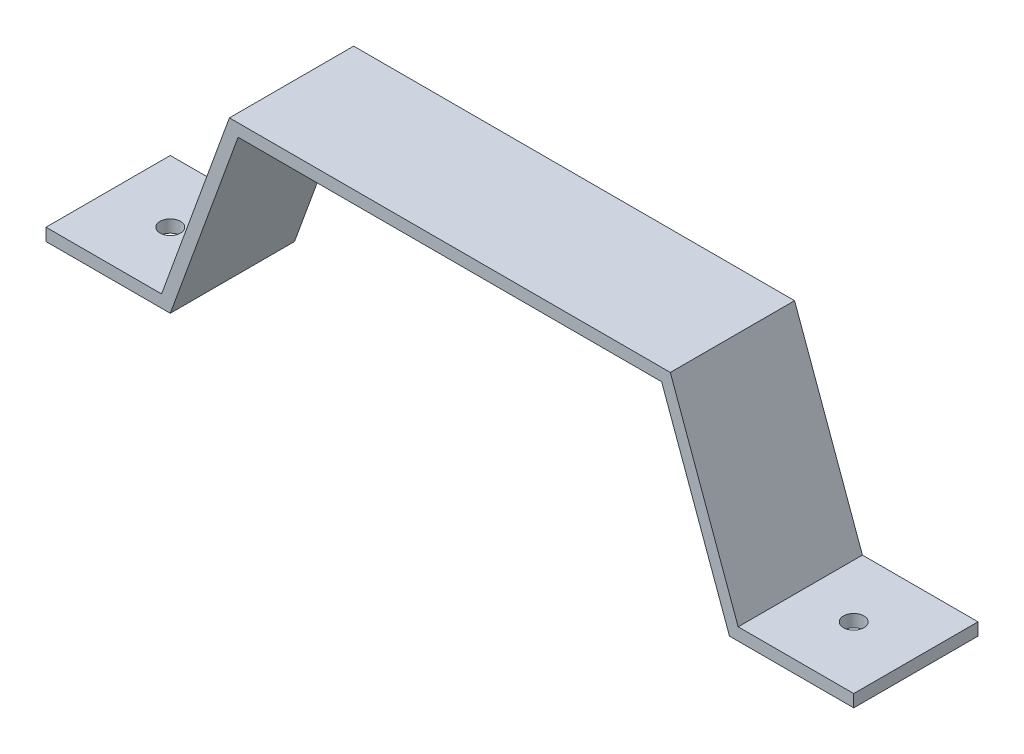
ISO-10303-21;
HEADER;
FILE_DESCRIPTION(('STEP AP214'),'2;1');
FILE_NAME('part.step','',(''),(''),'','','');
FILE_SCHEMA(('AUTOMOTIVE_DESIGN { 1 0 10303 214 1 1 1 1 }'));
ENDSEC;
DATA;
#1=APPLICATION_CONTEXT('core data for automotive mechanical design processes');
#2=APPLICATION_PROTOCOL_DEFINITION('international standard','automotive_design',2000,#1);
#3=PRODUCT_CONTEXT('',#1,'mechanical');
#4=PRODUCT('Part','Part','',(#3));
#5=PRODUCT_RELATED_PRODUCT_CATEGORY('part','',(#4));
#6=PRODUCT_DEFINITION_FORMATION('','',#4);
#7=PRODUCT_DEFINITION_CONTEXT('part definition',#1,'design');
#8=PRODUCT_DEFINITION('design','',#6,#7);
#9=PRODUCT_DEFINITION_SHAPE('','',#8);
#10=(LENGTH_UNIT() NAMED_UNIT(*) SI_UNIT(.MILLI.,.METRE.));
#11=(NAMED_UNIT(*) PLANE_ANGLE_UNIT() SI_UNIT($,.RADIAN.));
#12=(NAMED_UNIT(*) SI_UNIT($,.STERADIAN.) SOLID_ANGLE_UNIT());
#13=UNCERTAINTY_MEASURE_WITH_UNIT(LENGTH_MEASURE(1.E-05),#10,'distance_accuracy_value','');
#14=(GEOMETRIC_REPRESENTATION_CONTEXT(3) GLOBAL_UNCERTAINTY_ASSIGNED_CONTEXT((#13)) GLOBAL_UNIT_ASSIGNED_CONTEXT((#10,
#11,#12)) REPRESENTATION_CONTEXT('',''));
#15=CARTESIAN_POINT('',(0.,0.,0.));
#16=DIRECTION('',(0.,0.,1.));
#17=DIRECTION('',(1.,0.,0.));
#18=AXIS2_PLACEMENT_3D('',#15,#16,#17);
#19=CARTESIAN_POINT('',(-71.3521011514465,2.,20.));
#20=DIRECTION('',(1.,0.,0.));
#21=DIRECTION('',(0.,0.,-1.));
#22=AXIS2_PLACEMENT_3D('',#19,#20,#21);
#23=PLANE('',#22);
#24=DIRECTION('',(0.,-1.,0.));
#25=VECTOR('',#24,1.);
#26=CARTESIAN_POINT('',(-71.3521011514465,2.,0.));
#27=LINE('',#26,#25);
#28=CARTESIAN_POINT('',(-71.3521011514465,2.,0.));
#29=VERTEX_POINT('',#28);
#30=CARTESIAN_POINT('',(-71.3521011514465,0.,0.));
#31=VERTEX_POINT('',#30);
#32=EDGE_CURVE('E163',#29,#31,#27,.T.);
#33=ORIENTED_EDGE('',*,*,#32,.T.);
#34=DIRECTION('',(0.,0.,-1.));
#35=VECTOR('',#34,1.);
#36=CARTESIAN_POINT('',(-71.3521011514465,0.,20.));
#37=LINE('',#36,#35);
#38=CARTESIAN_POINT('',(-71.3521011514465,0.,20.));
#39=VERTEX_POINT('',#38);
#40=EDGE_CURVE('E11',#39,#31,#37,.T.);
#41=ORIENTED_EDGE('',*,*,#40,.F.);
#42=DIRECTION('',(0.,-1.,0.));
#43=VECTOR('',#42,1.);
#44=CARTESIAN_POINT('',(-71.3521011514465,2.,20.));
#45=LINE('',#44,#43);
#46=CARTESIAN_POINT('',(-71.3521011514465,2.,20.));
#47=VERTEX_POINT('',#46);
#48=EDGE_CURVE('E185',#47,#39,#45,.T.);
#49=ORIENTED_EDGE('',*,*,#48,.F.);
#50=DIRECTION('',(0.,0.,-1.));
#51=VECTOR('',#50,1.);
#52=CARTESIAN_POINT('',(-71.3521011514465,2.,20.));
#53=LINE('',#52,#51);
#54=EDGE_CURVE('E159',#47,#29,#53,.T.);
#55=ORIENTED_EDGE('',*,*,#54,.T.);
#56=EDGE_LOOP('',(#33,#41,#49,#55));
#57=FACE_BOUND('',#56,.T.);
#58=ADVANCED_FACE('F41',(#57),#23,.F.);
#59=CARTESIAN_POINT('',(-71.3521011514465,0.,20.));
#60=DIRECTION('',(0.,1.,0.));
#61=DIRECTION('',(-1.,0.,0.));
#62=AXIS2_PLACEMENT_3D('',#59,#60,#61);
#63=PLANE('',#62);
#64=CARTESIAN_POINT('',(-61.3521011514465,0.,10.));
#65=DIRECTION('',(0.,1.,0.));
#66=DIRECTION('',(0.,0.,1.));
#67=AXIS2_PLACEMENT_3D('',#64,#65,#66);
#68=CIRCLE('',#67,1.6450916652132);
#69=CARTESIAN_POINT('',(-61.3521011514465,0.,11.6450916652132));
#70=VERTEX_POINT('',#69);
#71=EDGE_CURVE('E215',#70,#70,#68,.T.);
#72=ORIENTED_EDGE('',*,*,#71,.T.);
#73=EDGE_LOOP('',(#72));
#74=FACE_BOUND('',#73,.T.);
#75=DIRECTION('',(1.,0.,0.));
#76=VECTOR('',#75,1.);
#77=CARTESIAN_POINT('',(-71.3521011514465,0.,0.));
#78=LINE('',#77,#76);
#79=CARTESIAN_POINT('',(-51.3521011514465,0.,0.));
#80=VERTEX_POINT('',#79);
#81=EDGE_CURVE('E166',#31,#80,#78,.T.);
#82=ORIENTED_EDGE('',*,*,#81,.T.);
#83=DIRECTION('',(0.,0.,-1.));
#84=VECTOR('',#83,1.);
#85=CARTESIAN_POINT('',(-51.3521011514465,0.,20.));
#86=LINE('',#85,#84);
#87=CARTESIAN_POINT('',(-51.3521011514465,0.,20.));
#88=VERTEX_POINT('',#87);
#89=EDGE_CURVE('E50',#88,#80,#86,.T.);
#90=ORIENTED_EDGE('',*,*,#89,.F.);
#91=DIRECTION('',(1.,0.,0.));
#92=VECTOR('',#91,1.);
#93=CARTESIAN_POINT('',(-71.3521011514465,0.,20.));
#94=LINE('',#93,#92);
#95=EDGE_CURVE('E114',#39,#88,#94,.T.);
#96=ORIENTED_EDGE('',*,*,#95,.F.);
#97=ORIENTED_EDGE('',*,*,#40,.T.);
#98=EDGE_LOOP('',(#82,#90,#96,#97));
#99=FACE_BOUND('',#98,.T.);
#100=ADVANCED_FACE('F266',(#74,#99),#63,.F.);
#101=CARTESIAN_POINT('',(-51.3521011514465,0.,20.));
#102=DIRECTION('',(-0.93969262078591,0.342020143325666,0.));
#103=DIRECTION('',(-0.342020143325666,-0.93969262078591,0.));
#104=AXIS2_PLACEMENT_3D('',#101,#102,#103);
#105=PLANE('',#104);
#106=DIRECTION('',(0.342020143325666,0.93969262078591,0.));
#107=VECTOR('',#106,1.);
#108=CARTESIAN_POINT('',(-51.3521011514465,0.,0.));
#109=LINE('',#108,#107);
#110=CARTESIAN_POINT('',(-40.4329941234606,30.,0.));
#111=VERTEX_POINT('',#110);
#112=EDGE_CURVE('E168',#80,#111,#109,.T.);
#113=ORIENTED_EDGE('',*,*,#112,.T.);
#114=DIRECTION('',(0.,0.,-1.));
#115=VECTOR('',#114,1.);
#116=CARTESIAN_POINT('',(-40.4329941234606,30.,20.));
#117=LINE('',#116,#115);
#118=CARTESIAN_POINT('',(-40.4329941234606,30.,20.));
#119=VERTEX_POINT('',#118);
#120=EDGE_CURVE('E204',#119,#111,#117,.T.);
#121=ORIENTED_EDGE('',*,*,#120,.F.);
#122=DIRECTION('',(0.342020143325666,0.93969262078591,0.));
#123=VECTOR('',#122,1.);
#124=CARTESIAN_POINT('',(-51.3521011514465,0.,20.));
#125=LINE('',#124,#123);
#126=EDGE_CURVE('E224',#88,#119,#125,.T.);
#127=ORIENTED_EDGE('',*,*,#126,.F.);
#128=ORIENTED_EDGE('',*,*,#89,.T.);
#129=EDGE_LOOP('',(#113,#121,#127,#128));
#130=FACE_BOUND('',#129,.T.);
#131=ADVANCED_FACE('F271',(#130),#105,.F.);
#132=CARTESIAN_POINT('',(-40.4329941234606,30.,20.));
#133=DIRECTION('',(0.,1.,0.));
#134=DIRECTION('',(-1.,0.,0.));
#135=AXIS2_PLACEMENT_3D('',#132,#133,#134);
#136=PLANE('',#135);
#137=DIRECTION('',(1.,0.,0.));
#138=VECTOR('',#137,1.);
#139=CARTESIAN_POINT('',(-40.4329941234606,30.,0.));
#140=LINE('',#139,#138);
#141=CARTESIAN_POINT('',(27.7287918205675,30.,0.));
#142=VERTEX_POINT('',#141);
#143=EDGE_CURVE('E170',#111,#142,#140,.T.);
#144=ORIENTED_EDGE('',*,*,#143,.T.);
#145=DIRECTION('',(0.,0.,-1.));
#146=VECTOR('',#145,1.);
#147=CARTESIAN_POINT('',(27.7287918205675,30.,20.));
#148=LINE('',#147,#146);
#149=CARTESIAN_POINT('',(27.7287918205675,30.,20.));
#150=VERTEX_POINT('',#149);
#151=EDGE_CURVE('E201',#150,#142,#148,.T.);
#152=ORIENTED_EDGE('',*,*,#151,.F.);
#153=DIRECTION('',(1.,0.,0.));
#154=VECTOR('',#153,1.);
#155=CARTESIAN_POINT('',(-40.4329941234606,30.,20.));
#156=LINE('',#155,#154);
#157=EDGE_CURVE('E226',#119,#150,#156,.T.);
#158=ORIENTED_EDGE('',*,*,#157,.F.);
#159=ORIENTED_EDGE('',*,*,#120,.T.);
#160=EDGE_LOOP('',(#144,#152,#158,#159));
#161=FACE_BOUND('',#160,.T.);
#162=ADVANCED_FACE('F277',(#161),#136,.F.);
#163=CARTESIAN_POINT('',(38.6478988485535,0.,20.));
#164=DIRECTION('',(0.939692620785909,0.342020143325666,0.));
#165=DIRECTION('',(-0.342020143325666,0.939692620785909,0.));
#166=AXIS2_PLACEMENT_3D('',#163,#164,#165);
#167=PLANE('',#166);
#168=DIRECTION('',(0.342020143325666,-0.939692620785909,0.));
#169=VECTOR('',#168,1.);
#170=CARTESIAN_POINT('',(38.6478988485535,0.,0.));
#171=LINE('',#170,#169);
#172=CARTESIAN_POINT('',(38.6478988485535,0.,0.));
#173=VERTEX_POINT('',#172);
#174=EDGE_CURVE('E172',#142,#173,#171,.T.);
#175=ORIENTED_EDGE('',*,*,#174,.T.);
#176=DIRECTION('',(0.,0.,-1.));
#177=VECTOR('',#176,1.);
#178=CARTESIAN_POINT('',(38.6478988485535,0.,20.));
#179=LINE('',#178,#177);
#180=CARTESIAN_POINT('',(38.6478988485535,0.,20.));
#181=VERTEX_POINT('',#180);
#182=EDGE_CURVE('E198',#181,#173,#179,.T.);
#183=ORIENTED_EDGE('',*,*,#182,.F.);
#184=DIRECTION('',(0.342020143325666,-0.939692620785909,0.));
#185=VECTOR('',#184,1.);
#186=CARTESIAN_POINT('',(38.6478988485535,0.,20.));
#187=LINE('',#186,#185);
#188=EDGE_CURVE('E228',#150,#181,#187,.T.);
#189=ORIENTED_EDGE('',*,*,#188,.F.);
#190=ORIENTED_EDGE('',*,*,#151,.T.);
#191=EDGE_LOOP('',(#175,#183,#189,#190));
#192=FACE_BOUND('',#191,.T.);
#193=ADVANCED_FACE('F283',(#192),#167,.F.);
#194=CARTESIAN_POINT('',(58.6478988485535,0.,20.));
#195=DIRECTION('',(0.,1.,0.));
#196=DIRECTION('',(-1.,0.,0.));
#197=AXIS2_PLACEMENT_3D('',#194,#195,#196);
#198=PLANE('',#197);
#199=CARTESIAN_POINT('',(48.6478988485535,0.,9.99999999999999));
#200=DIRECTION('',(0.,1.,0.));
#201=DIRECTION('',(0.,0.,-1.));
#202=AXIS2_PLACEMENT_3D('',#199,#200,#201);
#203=CIRCLE('',#202,1.6450916652132);
#204=CARTESIAN_POINT('',(48.6478988485535,0.,8.35490833478679));
#205=VERTEX_POINT('',#204);
#206=EDGE_CURVE('E210',#205,#205,#203,.T.);
#207=ORIENTED_EDGE('',*,*,#206,.T.);
#208=EDGE_LOOP('',(#207));
#209=FACE_BOUND('',#208,.T.);
#210=DIRECTION('',(1.,0.,0.));
#211=VECTOR('',#210,1.);
#212=CARTESIAN_POINT('',(58.6478988485535,0.,0.));
#213=LINE('',#212,#211);
#214=CARTESIAN_POINT('',(58.6478988485535,0.,0.));
#215=VERTEX_POINT('',#214);
#216=EDGE_CURVE('E174',#173,#215,#213,.T.);
#217=ORIENTED_EDGE('',*,*,#216,.T.);
#218=DIRECTION('',(0.,0.,-1.));
#219=VECTOR('',#218,1.);
#220=CARTESIAN_POINT('',(58.6478988485535,0.,20.));
#221=LINE('',#220,#219);
#222=CARTESIAN_POINT('',(58.6478988485535,0.,20.));
#223=VERTEX_POINT('',#222);
#224=EDGE_CURVE('E195',#223,#215,#221,.T.);
#225=ORIENTED_EDGE('',*,*,#224,.F.);
#226=DIRECTION('',(1.,0.,0.));
#227=VECTOR('',#226,1.);
#228=CARTESIAN_POINT('',(58.6478988485535,0.,20.));
#229=LINE('',#228,#227);
#230=EDGE_CURVE('E230',#181,#223,#229,.T.);
#231=ORIENTED_EDGE('',*,*,#230,.F.);
#232=ORIENTED_EDGE('',*,*,#182,.T.);
#233=EDGE_LOOP('',(#217,#225,#231,#232));
#234=FACE_BOUND('',#233,.T.);
#235=ADVANCED_FACE('F287',(#209,#234),#198,.F.);
#236=CARTESIAN_POINT('',(58.6478988485535,2.,20.));
#237=DIRECTION('',(-1.,0.,0.));
#238=DIRECTION('',(0.,0.,1.));
#239=AXIS2_PLACEMENT_3D('',#236,#237,#238);
#240=PLANE('',#239);
#241=DIRECTION('',(0.,1.,0.));
#242=VECTOR('',#241,1.);
#243=CARTESIAN_POINT('',(58.6478988485535,2.,0.));
#244=LINE('',#243,#242);
#245=CARTESIAN_POINT('',(58.6478988485535,2.,0.));
#246=VERTEX_POINT('',#245);
#247=EDGE_CURVE('E176',#215,#246,#244,.T.);
#248=ORIENTED_EDGE('',*,*,#247,.T.);
#249=DIRECTION('',(0.,0.,-1.));
#250=VECTOR('',#249,1.);
#251=CARTESIAN_POINT('',(58.6478988485535,2.,20.));
#252=LINE('',#251,#250);
#253=CARTESIAN_POINT('',(58.6478988485535,2.,20.));
#254=VERTEX_POINT('',#253);
#255=EDGE_CURVE('E192',#254,#246,#252,.T.);
#256=ORIENTED_EDGE('',*,*,#255,.F.);
#257=DIRECTION('',(0.,1.,0.));
#258=VECTOR('',#257,1.);
#259=CARTESIAN_POINT('',(58.6478988485535,2.,20.));
#260=LINE('',#259,#258);
#261=EDGE_CURVE('E232',#223,#254,#260,.T.);
#262=ORIENTED_EDGE('',*,*,#261,.F.);
#263=ORIENTED_EDGE('',*,*,#224,.T.);
#264=EDGE_LOOP('',(#248,#256,#262,#263));
#265=FACE_BOUND('',#264,.T.);
#266=ADVANCED_FACE('F290',(#265),#240,.F.);
#267=CARTESIAN_POINT('',(40.0483139249729,1.99999999999999,20.));
#268=DIRECTION('',(0.,-1.,0.));
#269=DIRECTION('',(1.,0.,0.));
#270=AXIS2_PLACEMENT_3D('',#267,#268,#269);
#271=PLANE('',#270);
#272=CARTESIAN_POINT('',(48.6478988485535,1.99999999999999,9.99999999999999));
#273=DIRECTION('',(0.,-1.,0.));
#274=DIRECTION('',(1.,0.,0.));
#275=AXIS2_PLACEMENT_3D('',#272,#273,#274);
#276=CIRCLE('',#275,1.6450916652132);
#277=CARTESIAN_POINT('',(50.2929905137667,2.,9.99999999999999));
#278=VERTEX_POINT('',#277);
#279=EDGE_CURVE('E44',#278,#278,#276,.F.);
#280=ORIENTED_EDGE('',*,*,#279,.F.);
#281=EDGE_LOOP('',(#280));
#282=FACE_BOUND('',#281,.T.);
#283=DIRECTION('',(-1.,0.,0.));
#284=VECTOR('',#283,1.);
#285=CARTESIAN_POINT('',(40.0483139249729,1.99999999999999,0.));
#286=LINE('',#285,#284);
#287=CARTESIAN_POINT('',(40.0483139249729,1.99999999999999,0.));
#288=VERTEX_POINT('',#287);
#289=EDGE_CURVE('E178',#246,#288,#286,.T.);
#290=ORIENTED_EDGE('',*,*,#289,.T.);
#291=DIRECTION('',(0.,0.,-1.));
#292=VECTOR('',#291,1.);
#293=CARTESIAN_POINT('',(40.0483139249729,1.99999999999999,20.));
#294=LINE('',#293,#292);
#295=CARTESIAN_POINT('',(40.0483139249729,1.99999999999999,20.));
#296=VERTEX_POINT('',#295);
#297=EDGE_CURVE('E189',#296,#288,#294,.T.);
#298=ORIENTED_EDGE('',*,*,#297,.F.);
#299=DIRECTION('',(-1.,0.,0.));
#300=VECTOR('',#299,1.);
#301=CARTESIAN_POINT('',(40.0483139249729,1.99999999999999,20.));
#302=LINE('',#301,#300);
#303=EDGE_CURVE('E234',#254,#296,#302,.T.);
#304=ORIENTED_EDGE('',*,*,#303,.F.);
#305=ORIENTED_EDGE('',*,*,#255,.T.);
#306=EDGE_LOOP('',(#290,#298,#304,#305));
#307=FACE_BOUND('',#306,.T.);
#308=ADVANCED_FACE('F240',(#282,#307),#271,.F.);
#309=CARTESIAN_POINT('',(29.129206896987,32.,20.));
#310=DIRECTION('',(-0.939692620785909,-0.342020143325666,0.));
#311=DIRECTION('',(0.342020143325666,-0.939692620785909,0.));
#312=AXIS2_PLACEMENT_3D('',#309,#310,#311);
#313=PLANE('',#312);
#314=DIRECTION('',(-0.342020143325666,0.939692620785909,0.));
#315=VECTOR('',#314,1.);
#316=CARTESIAN_POINT('',(29.129206896987,32.,0.));
#317=LINE('',#316,#315);
#318=CARTESIAN_POINT('',(29.129206896987,32.,0.));
#319=VERTEX_POINT('',#318);
#320=EDGE_CURVE('E180',#288,#319,#317,.T.);
#321=ORIENTED_EDGE('',*,*,#320,.T.);
#322=DIRECTION('',(0.,0.,-1.));
#323=VECTOR('',#322,1.);
#324=CARTESIAN_POINT('',(29.129206896987,32.,20.));
#325=LINE('',#324,#323);
#326=CARTESIAN_POINT('',(29.129206896987,32.,20.));
#327=VERTEX_POINT('',#326);
#328=EDGE_CURVE('E154',#327,#319,#325,.T.);
#329=ORIENTED_EDGE('',*,*,#328,.F.);
#330=DIRECTION('',(-0.342020143325666,0.939692620785909,0.));
#331=VECTOR('',#330,1.);
#332=CARTESIAN_POINT('',(29.129206896987,32.,20.));
#333=LINE('',#332,#331);
#334=EDGE_CURVE('E145',#296,#327,#333,.T.);
#335=ORIENTED_EDGE('',*,*,#334,.F.);
#336=ORIENTED_EDGE('',*,*,#297,.T.);
#337=EDGE_LOOP('',(#321,#329,#335,#336));
#338=FACE_BOUND('',#337,.T.);
#339=ADVANCED_FACE('F244',(#338),#313,.F.);
#340=CARTESIAN_POINT('',(29.129206896987,32.,20.));
#341=DIRECTION('',(0.,-1.,0.));
#342=DIRECTION('',(0.,0.,-1.));
#343=AXIS2_PLACEMENT_3D('',#340,#341,#342);
#344=PLANE('',#343);
#345=DIRECTION('',(-1.,0.,0.));
#346=VECTOR('',#345,1.);
#347=CARTESIAN_POINT('',(29.129206896987,32.,0.));
#348=LINE('',#347,#346);
#349=CARTESIAN_POINT('',(-41.83340919988,32.,0.));
#350=VERTEX_POINT('',#349);
#351=EDGE_CURVE('E153',#319,#350,#348,.T.);
#352=ORIENTED_EDGE('',*,*,#351,.T.);
#353=DIRECTION('',(0.,0.,-1.));
#354=VECTOR('',#353,1.);
#355=CARTESIAN_POINT('',(-41.83340919988,32.,20.));
#356=LINE('',#355,#354);
#357=CARTESIAN_POINT('',(-41.83340919988,32.,20.));
#358=VERTEX_POINT('',#357);
#359=EDGE_CURVE('E150',#358,#350,#356,.T.);
#360=ORIENTED_EDGE('',*,*,#359,.F.);
#361=DIRECTION('',(-1.,0.,0.));
#362=VECTOR('',#361,1.);
#363=CARTESIAN_POINT('',(29.129206896987,32.,20.));
#364=LINE('',#363,#362);
#365=EDGE_CURVE('E139',#327,#358,#364,.T.);
#366=ORIENTED_EDGE('',*,*,#365,.F.);
#367=ORIENTED_EDGE('',*,*,#328,.T.);
#368=EDGE_LOOP('',(#352,#360,#366,#367));
#369=FACE_BOUND('',#368,.T.);
#370=ADVANCED_FACE('F151',(#369),#344,.F.);
#371=CARTESIAN_POINT('',(-41.83340919988,32.,20.));
#372=DIRECTION('',(0.93969262078591,-0.342020143325665,0.));
#373=DIRECTION('',(0.342020143325665,0.93969262078591,0.));
#374=AXIS2_PLACEMENT_3D('',#371,#372,#373);
#375=PLANE('',#374);
#376=DIRECTION('',(-0.342020143325665,-0.939692620785909,0.));
#377=VECTOR('',#376,1.);
#378=CARTESIAN_POINT('',(-41.83340919988,32.,0.));
#379=LINE('',#378,#377);
#380=CARTESIAN_POINT('',(-52.7525162278659,2.,0.));
#381=VERTEX_POINT('',#380);
#382=EDGE_CURVE('E100',#350,#381,#379,.T.);
#383=ORIENTED_EDGE('',*,*,#382,.T.);
#384=DIRECTION('',(0.,0.,-1.));
#385=VECTOR('',#384,1.);
#386=CARTESIAN_POINT('',(-52.7525162278659,2.,20.));
#387=LINE('',#386,#385);
#388=CARTESIAN_POINT('',(-52.7525162278659,2.,20.));
#389=VERTEX_POINT('',#388);
#390=EDGE_CURVE('E155',#389,#381,#387,.T.);
#391=ORIENTED_EDGE('',*,*,#390,.F.);
#392=DIRECTION('',(-0.342020143325665,-0.939692620785909,0.));
#393=VECTOR('',#392,1.);
#394=CARTESIAN_POINT('',(-41.83340919988,32.,20.));
#395=LINE('',#394,#393);
#396=EDGE_CURVE('E143',#358,#389,#395,.T.);
#397=ORIENTED_EDGE('',*,*,#396,.F.);
#398=ORIENTED_EDGE('',*,*,#359,.T.);
#399=EDGE_LOOP('',(#383,#391,#397,#398));
#400=FACE_BOUND('',#399,.T.);
#401=ADVANCED_FACE('F157',(#400),#375,.F.);
#402=CARTESIAN_POINT('',(-52.7525162278659,2.,20.));
#403=DIRECTION('',(0.,-1.,0.));
#404=DIRECTION('',(1.,0.,0.));
#405=AXIS2_PLACEMENT_3D('',#402,#403,#404);
#406=PLANE('',#405);
#407=CARTESIAN_POINT('',(-61.3521011514465,2.,10.));
#408=DIRECTION('',(0.,-1.,0.));
#409=DIRECTION('',(1.,0.,0.));
#410=AXIS2_PLACEMENT_3D('',#407,#408,#409);
#411=CIRCLE('',#410,1.6450916652132);
#412=CARTESIAN_POINT('',(-59.7070094862333,2.,10.));
#413=VERTEX_POINT('',#412);
#414=EDGE_CURVE('E208',#413,#413,#411,.F.);
#415=ORIENTED_EDGE('',*,*,#414,.F.);
#416=EDGE_LOOP('',(#415));
#417=FACE_BOUND('',#416,.T.);
#418=DIRECTION('',(-1.,0.,0.));
#419=VECTOR('',#418,1.);
#420=CARTESIAN_POINT('',(-52.7525162278659,2.,0.));
#421=LINE('',#420,#419);
#422=EDGE_CURVE('E106',#381,#29,#421,.T.);
#423=ORIENTED_EDGE('',*,*,#422,.T.);
#424=ORIENTED_EDGE('',*,*,#54,.F.);
#425=DIRECTION('',(-1.,0.,0.));
#426=VECTOR('',#425,1.);
#427=CARTESIAN_POINT('',(-52.7525162278659,2.,20.));
#428=LINE('',#427,#426);
#429=EDGE_CURVE('E59',#389,#47,#428,.T.);
#430=ORIENTED_EDGE('',*,*,#429,.F.);
#431=ORIENTED_EDGE('',*,*,#390,.T.);
#432=EDGE_LOOP('',(#423,#424,#430,#431));
#433=FACE_BOUND('',#432,.T.);
#434=ADVANCED_FACE('F252',(#417,#433),#406,.F.);
#435=CARTESIAN_POINT('',(0.,0.,20.));
#436=DIRECTION('',(0.,0.,1.));
#437=DIRECTION('',(1.,0.,0.));
#438=AXIS2_PLACEMENT_3D('',#435,#436,#437);
#439=PLANE('',#438);
#440=ORIENTED_EDGE('',*,*,#48,.T.);
#441=ORIENTED_EDGE('',*,*,#95,.T.);
#442=ORIENTED_EDGE('',*,*,#126,.T.);
#443=ORIENTED_EDGE('',*,*,#157,.T.);
#444=ORIENTED_EDGE('',*,*,#188,.T.);
#445=ORIENTED_EDGE('',*,*,#230,.T.);
#446=ORIENTED_EDGE('',*,*,#261,.T.);
#447=ORIENTED_EDGE('',*,*,#303,.T.);
#448=ORIENTED_EDGE('',*,*,#334,.T.);
#449=ORIENTED_EDGE('',*,*,#365,.T.);
#450=ORIENTED_EDGE('',*,*,#396,.T.);
#451=ORIENTED_EDGE('',*,*,#429,.T.);
#452=EDGE_LOOP('',(#440,#441,#442,#443,#444,#445,#446,#447,#448,#449,#450,#451));
#453=FACE_BOUND('',#452,.T.);
#454=ADVANCED_FACE('F141',(#453),#439,.T.);
#455=CARTESIAN_POINT('',(0.,0.,0.));
#456=DIRECTION('',(0.,0.,1.));
#457=DIRECTION('',(1.,0.,0.));
#458=AXIS2_PLACEMENT_3D('',#455,#456,#457);
#459=PLANE('',#458);
#460=ORIENTED_EDGE('',*,*,#32,.F.);
#461=ORIENTED_EDGE('',*,*,#422,.F.);
#462=ORIENTED_EDGE('',*,*,#382,.F.);
#463=ORIENTED_EDGE('',*,*,#351,.F.);
#464=ORIENTED_EDGE('',*,*,#320,.F.);
#465=ORIENTED_EDGE('',*,*,#289,.F.);
#466=ORIENTED_EDGE('',*,*,#247,.F.);
#467=ORIENTED_EDGE('',*,*,#216,.F.);
#468=ORIENTED_EDGE('',*,*,#174,.F.);
#469=ORIENTED_EDGE('',*,*,#143,.F.);
#470=ORIENTED_EDGE('',*,*,#112,.F.);
#471=ORIENTED_EDGE('',*,*,#81,.F.);
#472=EDGE_LOOP('',(#460,#461,#462,#463,#464,#465,#466,#467,#468,#469,#470,#471));
#473=FACE_BOUND('',#472,.T.);
#474=ADVANCED_FACE('F247',(#473),#459,.F.);
#475=CARTESIAN_POINT('',(-61.3521011514465,20.,10.));
#476=DIRECTION('',(0.,-1.,0.));
#477=DIRECTION('',(0.,0.,-1.));
#478=AXIS2_PLACEMENT_3D('',#475,#476,#477);
#479=CYLINDRICAL_SURFACE('',#478,1.6450916652132);
#480=ORIENTED_EDGE('',*,*,#71,.F.);
#481=EDGE_LOOP('',(#480));
#482=FACE_BOUND('',#481,.T.);
#483=ORIENTED_EDGE('',*,*,#414,.T.);
#484=EDGE_LOOP('',(#483));
#485=FACE_BOUND('',#484,.T.);
#486=ADVANCED_FACE('F318',(#482,#485),#479,.F.);
#487=CARTESIAN_POINT('',(48.6478988485535,20.,9.99999999999999));
#488=DIRECTION('',(0.,-1.,0.));
#489=DIRECTION('',(0.,0.,-1.));
#490=AXIS2_PLACEMENT_3D('',#487,#488,#489);
#491=CYLINDRICAL_SURFACE('',#490,1.6450916652132);
#492=ORIENTED_EDGE('',*,*,#206,.F.);
#493=EDGE_LOOP('',(#492));
#494=FACE_BOUND('',#493,.T.);
#495=ORIENTED_EDGE('',*,*,#279,.T.);
#496=EDGE_LOOP('',(#495));
#497=FACE_BOUND('',#496,.T.);
#498=ADVANCED_FACE('F328',(#494,#497),#491,.F.);
#499=CLOSED_SHELL('',(#58,#100,#131,#162,#193,#235,#266,#308,#339,#370,#401,#434,#454,#474,#486,#498));
#500=MANIFOLD_SOLID_BREP('B2',#499);
#501=ADVANCED_BREP_SHAPE_REPRESENTATION('',(#18,#500),#14);
#502=SHAPE_DEFINITION_REPRESENTATION(#9,#501);
ENDSEC;
END-ISO-10303-21;
